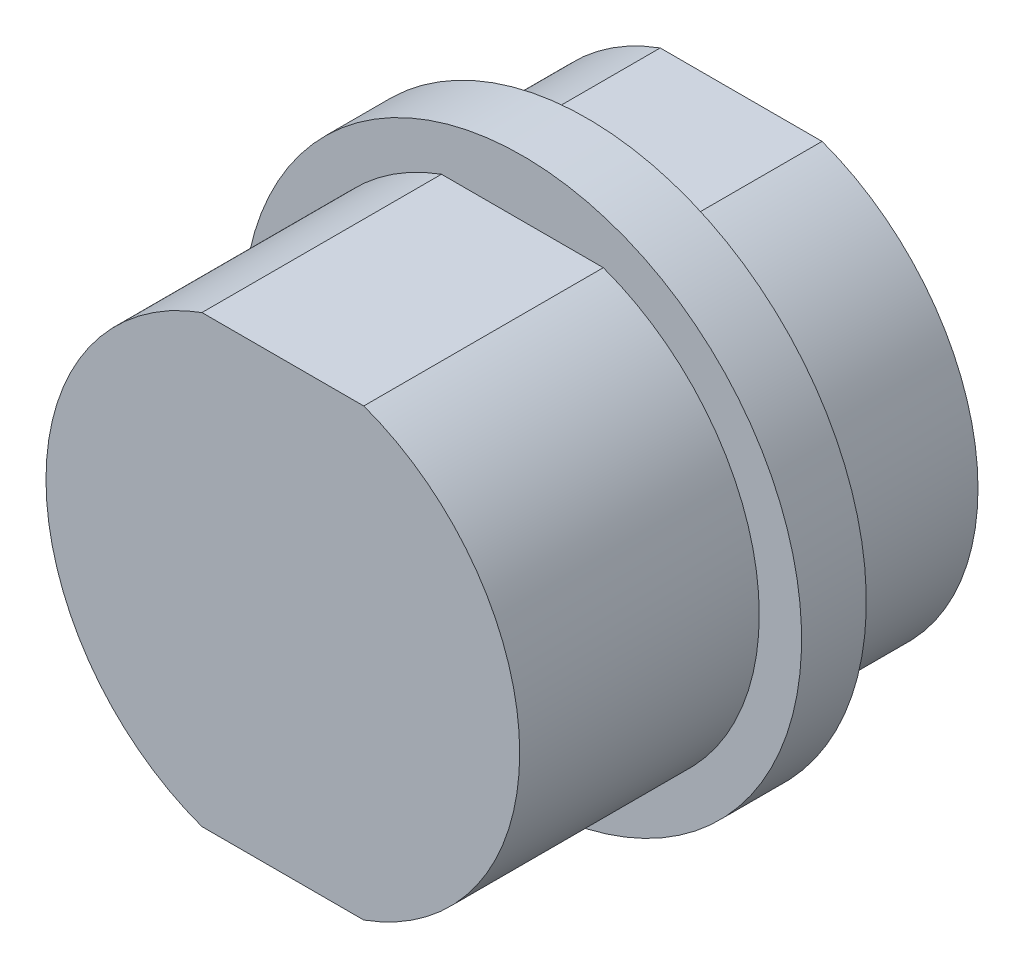
ISO-10303-21;
HEADER;
FILE_DESCRIPTION(('STEP AP214'),'2;1');
FILE_NAME('part.step','',(''),(''),'','','');
FILE_SCHEMA(('AUTOMOTIVE_DESIGN { 1 0 10303 214 1 1 1 1 }'));
ENDSEC;
DATA;
#1=APPLICATION_CONTEXT('core data for automotive mechanical design processes');
#2=APPLICATION_PROTOCOL_DEFINITION('international standard','automotive_design',2000,#1);
#3=PRODUCT_CONTEXT('',#1,'mechanical');
#4=PRODUCT('Part','Part','',(#3));
#5=PRODUCT_RELATED_PRODUCT_CATEGORY('part','',(#4));
#6=PRODUCT_DEFINITION_FORMATION('','',#4);
#7=PRODUCT_DEFINITION_CONTEXT('part definition',#1,'design');
#8=PRODUCT_DEFINITION('design','',#6,#7);
#9=PRODUCT_DEFINITION_SHAPE('','',#8);
#10=(LENGTH_UNIT() NAMED_UNIT(*) SI_UNIT(.MILLI.,.METRE.));
#11=(NAMED_UNIT(*) PLANE_ANGLE_UNIT() SI_UNIT($,.RADIAN.));
#12=(NAMED_UNIT(*) SI_UNIT($,.STERADIAN.) SOLID_ANGLE_UNIT());
#13=UNCERTAINTY_MEASURE_WITH_UNIT(LENGTH_MEASURE(1.E-05),#10,'distance_accuracy_value','');
#14=(GEOMETRIC_REPRESENTATION_CONTEXT(3) GLOBAL_UNCERTAINTY_ASSIGNED_CONTEXT((#13)) GLOBAL_UNIT_ASSIGNED_CONTEXT((#10,
#11,#12)) REPRESENTATION_CONTEXT('',''));
#15=CARTESIAN_POINT('',(0.,0.,0.));
#16=DIRECTION('',(0.,0.,1.));
#17=DIRECTION('',(1.,0.,0.));
#18=AXIS2_PLACEMENT_3D('',#15,#16,#17);
#19=CARTESIAN_POINT('',(0.,0.,15.113));
#20=DIRECTION('',(0.,0.,-1.));
#21=DIRECTION('',(-1.,0.,0.));
#22=AXIS2_PLACEMENT_3D('',#19,#20,#21);
#23=CYLINDRICAL_SURFACE('',#22,7.8105);
#24=CARTESIAN_POINT('',(0.,0.,7.2136));
#25=DIRECTION('',(0.,0.,-1.));
#26=DIRECTION('',(-1.,0.,0.));
#27=AXIS2_PLACEMENT_3D('',#24,#25,#26);
#28=CIRCLE('',#27,7.8105);
#29=CARTESIAN_POINT('',(2.66823947388536,7.3406,7.2136));
#30=VERTEX_POINT('',#29);
#31=CARTESIAN_POINT('',(2.66823947388536,-7.3406,7.2136));
#32=VERTEX_POINT('',#31);
#33=EDGE_CURVE('E56',#30,#32,#28,.T.);
#34=ORIENTED_EDGE('',*,*,#33,.F.);
#35=DIRECTION('',(0.,0.,-1.));
#36=VECTOR('',#35,1.);
#37=CARTESIAN_POINT('',(2.66823947388536,7.3406,15.113));
#38=LINE('',#37,#36);
#39=CARTESIAN_POINT('',(2.66823947388536,7.3406,15.113));
#40=VERTEX_POINT('',#39);
#41=EDGE_CURVE('E130',#30,#40,#38,.F.);
#42=ORIENTED_EDGE('',*,*,#41,.T.);
#43=CARTESIAN_POINT('',(0.,0.,15.113));
#44=DIRECTION('',(0.,0.,1.));
#45=DIRECTION('',(1.,0.,0.));
#46=AXIS2_PLACEMENT_3D('',#43,#44,#45);
#47=CIRCLE('',#46,7.8105);
#48=CARTESIAN_POINT('',(2.66823947388536,-7.3406,15.113));
#49=VERTEX_POINT('',#48);
#50=EDGE_CURVE('E140',#49,#40,#47,.T.);
#51=ORIENTED_EDGE('',*,*,#50,.F.);
#52=DIRECTION('',(0.,0.,-1.));
#53=VECTOR('',#52,1.);
#54=CARTESIAN_POINT('',(2.66823947388536,-7.3406,15.113));
#55=LINE('',#54,#53);
#56=EDGE_CURVE('E120',#49,#32,#55,.T.);
#57=ORIENTED_EDGE('',*,*,#56,.T.);
#58=EDGE_LOOP('',(#34,#42,#51,#57));
#59=FACE_BOUND('',#58,.T.);
#60=ADVANCED_FACE('F33',(#59),#23,.T.);
#61=CARTESIAN_POINT('',(0.,0.,7.2136));
#62=DIRECTION('',(0.,0.,-1.));
#63=DIRECTION('',(-1.,0.,0.));
#64=AXIS2_PLACEMENT_3D('',#61,#62,#63);
#65=CIRCLE('',#64,7.8105);
#66=CARTESIAN_POINT('',(-2.66823947388536,-7.3406,7.2136));
#67=VERTEX_POINT('',#66);
#68=CARTESIAN_POINT('',(-2.66823947388536,7.3406,7.2136));
#69=VERTEX_POINT('',#68);
#70=EDGE_CURVE('E154',#67,#69,#65,.T.);
#71=ORIENTED_EDGE('',*,*,#70,.F.);
#72=DIRECTION('',(0.,0.,-1.));
#73=VECTOR('',#72,1.);
#74=CARTESIAN_POINT('',(-2.66823947388536,-7.3406,15.113));
#75=LINE('',#74,#73);
#76=CARTESIAN_POINT('',(-2.66823947388536,-7.3406,15.113));
#77=VERTEX_POINT('',#76);
#78=EDGE_CURVE('E124',#67,#77,#75,.F.);
#79=ORIENTED_EDGE('',*,*,#78,.T.);
#80=CARTESIAN_POINT('',(-2.66823947388536,7.3406,15.113));
#81=VERTEX_POINT('',#80);
#82=EDGE_CURVE('E136',#81,#77,#47,.T.);
#83=ORIENTED_EDGE('',*,*,#82,.F.);
#84=DIRECTION('',(0.,0.,-1.));
#85=VECTOR('',#84,1.);
#86=CARTESIAN_POINT('',(-2.66823947388536,7.3406,15.113));
#87=LINE('',#86,#85);
#88=EDGE_CURVE('E133',#81,#69,#87,.T.);
#89=ORIENTED_EDGE('',*,*,#88,.T.);
#90=EDGE_LOOP('',(#71,#79,#83,#89));
#91=FACE_BOUND('',#90,.T.);
#92=ADVANCED_FACE('F168',(#91),#23,.T.);
#93=CARTESIAN_POINT('',(-7.44155178120373,7.3406,0.));
#94=DIRECTION('',(0.,-1.,0.));
#95=DIRECTION('',(0.,0.,-1.));
#96=AXIS2_PLACEMENT_3D('',#93,#94,#95);
#97=PLANE('',#96);
#98=DIRECTION('',(1.,0.,0.));
#99=VECTOR('',#98,1.);
#100=CARTESIAN_POINT('',(-7.44155178120373,7.3406,7.2136));
#101=LINE('',#100,#99);
#102=EDGE_CURVE('E48',#69,#30,#101,.T.);
#103=ORIENTED_EDGE('',*,*,#102,.F.);
#104=ORIENTED_EDGE('',*,*,#88,.F.);
#105=DIRECTION('',(1.,0.,0.));
#106=VECTOR('',#105,1.);
#107=CARTESIAN_POINT('',(-7.44155178120373,7.3406,15.113));
#108=LINE('',#107,#106);
#109=EDGE_CURVE('E123',#81,#40,#108,.T.);
#110=ORIENTED_EDGE('',*,*,#109,.T.);
#111=ORIENTED_EDGE('',*,*,#41,.F.);
#112=EDGE_LOOP('',(#103,#104,#110,#111));
#113=FACE_BOUND('',#112,.T.);
#114=ADVANCED_FACE('F192',(#113),#97,.F.);
#115=CARTESIAN_POINT('',(-7.44155178120373,-7.3406,0.));
#116=DIRECTION('',(0.,1.,0.));
#117=DIRECTION('',(0.,0.,1.));
#118=AXIS2_PLACEMENT_3D('',#115,#116,#117);
#119=PLANE('',#118);
#120=DIRECTION('',(-1.,0.,0.));
#121=VECTOR('',#120,1.);
#122=CARTESIAN_POINT('',(-7.44155178120373,-7.3406,7.2136));
#123=LINE('',#122,#121);
#124=EDGE_CURVE('E11',#32,#67,#123,.T.);
#125=ORIENTED_EDGE('',*,*,#124,.F.);
#126=ORIENTED_EDGE('',*,*,#56,.F.);
#127=DIRECTION('',(-1.,0.,0.));
#128=VECTOR('',#127,1.);
#129=CARTESIAN_POINT('',(-7.44155178120373,-7.3406,15.113));
#130=LINE('',#129,#128);
#131=EDGE_CURVE('E161',#49,#77,#130,.T.);
#132=ORIENTED_EDGE('',*,*,#131,.T.);
#133=ORIENTED_EDGE('',*,*,#78,.F.);
#134=EDGE_LOOP('',(#125,#126,#132,#133));
#135=FACE_BOUND('',#134,.T.);
#136=ADVANCED_FACE('F169',(#135),#119,.F.);
#137=CARTESIAN_POINT('',(0.,0.,15.113));
#138=DIRECTION('',(0.,0.,1.));
#139=DIRECTION('',(1.,0.,0.));
#140=AXIS2_PLACEMENT_3D('',#137,#138,#139);
#141=PLANE('',#140);
#142=ORIENTED_EDGE('',*,*,#131,.F.);
#143=ORIENTED_EDGE('',*,*,#50,.T.);
#144=ORIENTED_EDGE('',*,*,#109,.F.);
#145=ORIENTED_EDGE('',*,*,#82,.T.);
#146=EDGE_LOOP('',(#142,#143,#144,#145));
#147=FACE_BOUND('',#146,.T.);
#148=ADVANCED_FACE('F175',(#147),#141,.T.);
#149=CARTESIAN_POINT('',(0.,0.,7.2136));
#150=DIRECTION('',(0.,0.,-1.));
#151=DIRECTION('',(-1.,0.,0.));
#152=AXIS2_PLACEMENT_3D('',#149,#150,#151);
#153=PLANE('',#152);
#154=CARTESIAN_POINT('',(0.,0.,7.2136));
#155=DIRECTION('',(0.,0.,-1.));
#156=DIRECTION('',(-1.,0.,0.));
#157=AXIS2_PLACEMENT_3D('',#154,#155,#156);
#158=CIRCLE('',#157,9.2075);
#159=CARTESIAN_POINT('',(-9.2075,0.,7.2136));
#160=VERTEX_POINT('',#159);
#161=EDGE_CURVE('E219',#160,#160,#158,.T.);
#162=ORIENTED_EDGE('',*,*,#161,.F.);
#163=EDGE_LOOP('',(#162));
#164=FACE_BOUND('',#163,.T.);
#165=ORIENTED_EDGE('',*,*,#70,.T.);
#166=ORIENTED_EDGE('',*,*,#102,.T.);
#167=ORIENTED_EDGE('',*,*,#33,.T.);
#168=ORIENTED_EDGE('',*,*,#124,.T.);
#169=EDGE_LOOP('',(#165,#166,#167,#168));
#170=FACE_BOUND('',#169,.T.);
#171=ADVANCED_FACE('F173',(#164,#170),#153,.F.);
#172=CARTESIAN_POINT('',(0.,0.,5.08));
#173=DIRECTION('',(0.,0.,-1.));
#174=DIRECTION('',(-1.,0.,0.));
#175=AXIS2_PLACEMENT_3D('',#172,#173,#174);
#176=PLANE('',#175);
#177=CARTESIAN_POINT('',(0.,0.,5.08));
#178=DIRECTION('',(0.,0.,-1.));
#179=DIRECTION('',(-1.,0.,0.));
#180=AXIS2_PLACEMENT_3D('',#177,#178,#179);
#181=CIRCLE('',#180,9.2075);
#182=CARTESIAN_POINT('',(-9.2075,0.,5.08));
#183=VERTEX_POINT('',#182);
#184=EDGE_CURVE('E222',#183,#183,#181,.T.);
#185=ORIENTED_EDGE('',*,*,#184,.T.);
#186=EDGE_LOOP('',(#185));
#187=FACE_BOUND('',#186,.T.);
#188=DIRECTION('',(1.,0.,0.));
#189=VECTOR('',#188,1.);
#190=CARTESIAN_POINT('',(-7.44155178120373,7.3406,5.08));
#191=LINE('',#190,#189);
#192=CARTESIAN_POINT('',(-2.66823947388536,7.3406,5.08));
#193=VERTEX_POINT('',#192);
#194=CARTESIAN_POINT('',(2.66823947388536,7.3406,5.08));
#195=VERTEX_POINT('',#194);
#196=EDGE_CURVE('E115',#193,#195,#191,.T.);
#197=ORIENTED_EDGE('',*,*,#196,.F.);
#198=CARTESIAN_POINT('',(0.,0.,5.08));
#199=DIRECTION('',(0.,0.,-1.));
#200=DIRECTION('',(-1.,0.,0.));
#201=AXIS2_PLACEMENT_3D('',#198,#199,#200);
#202=CIRCLE('',#201,7.8105);
#203=CARTESIAN_POINT('',(-2.66823947388536,-7.3406,5.08));
#204=VERTEX_POINT('',#203);
#205=EDGE_CURVE('E103',#204,#193,#202,.T.);
#206=ORIENTED_EDGE('',*,*,#205,.F.);
#207=DIRECTION('',(-1.,0.,0.));
#208=VECTOR('',#207,1.);
#209=CARTESIAN_POINT('',(-7.44155178120373,-7.3406,5.08));
#210=LINE('',#209,#208);
#211=CARTESIAN_POINT('',(2.66823947388536,-7.3406,5.08));
#212=VERTEX_POINT('',#211);
#213=EDGE_CURVE('E41',#212,#204,#210,.T.);
#214=ORIENTED_EDGE('',*,*,#213,.F.);
#215=CARTESIAN_POINT('',(0.,0.,5.08));
#216=DIRECTION('',(0.,0.,-1.));
#217=DIRECTION('',(-1.,0.,0.));
#218=AXIS2_PLACEMENT_3D('',#215,#216,#217);
#219=CIRCLE('',#218,7.8105);
#220=EDGE_CURVE('E100',#195,#212,#219,.T.);
#221=ORIENTED_EDGE('',*,*,#220,.F.);
#222=EDGE_LOOP('',(#197,#206,#214,#221));
#223=FACE_BOUND('',#222,.T.);
#224=ADVANCED_FACE('F99',(#187,#223),#176,.T.);
#225=CARTESIAN_POINT('',(0.,0.,7.2136));
#226=DIRECTION('',(0.,0.,-1.));
#227=DIRECTION('',(-1.,0.,0.));
#228=AXIS2_PLACEMENT_3D('',#225,#226,#227);
#229=CYLINDRICAL_SURFACE('',#228,9.2075);
#230=ORIENTED_EDGE('',*,*,#161,.T.);
#231=EDGE_LOOP('',(#230));
#232=FACE_BOUND('',#231,.T.);
#233=ORIENTED_EDGE('',*,*,#184,.F.);
#234=EDGE_LOOP('',(#233));
#235=FACE_BOUND('',#234,.T.);
#236=ADVANCED_FACE('F182',(#232,#235),#229,.T.);
#237=CARTESIAN_POINT('',(0.,0.,0.));
#238=DIRECTION('',(0.,0.,1.));
#239=DIRECTION('',(1.,0.,0.));
#240=AXIS2_PLACEMENT_3D('',#237,#238,#239);
#241=PLANE('',#240);
#242=CARTESIAN_POINT('',(0.,0.,0.));
#243=DIRECTION('',(0.,0.,1.));
#244=DIRECTION('',(1.,0.,0.));
#245=AXIS2_PLACEMENT_3D('',#242,#243,#244);
#246=CIRCLE('',#245,7.8105);
#247=CARTESIAN_POINT('',(2.66823947388536,-7.3406,0.));
#248=VERTEX_POINT('',#247);
#249=CARTESIAN_POINT('',(2.66823947388536,7.3406,0.));
#250=VERTEX_POINT('',#249);
#251=EDGE_CURVE('E135',#248,#250,#246,.T.);
#252=ORIENTED_EDGE('',*,*,#251,.F.);
#253=DIRECTION('',(-1.,0.,0.));
#254=VECTOR('',#253,1.);
#255=CARTESIAN_POINT('',(0.,-7.3406,0.));
#256=LINE('',#255,#254);
#257=CARTESIAN_POINT('',(-2.66823947388536,-7.3406,0.));
#258=VERTEX_POINT('',#257);
#259=EDGE_CURVE('E107',#248,#258,#256,.T.);
#260=ORIENTED_EDGE('',*,*,#259,.T.);
#261=CARTESIAN_POINT('',(-2.66823947388536,7.3406,0.));
#262=VERTEX_POINT('',#261);
#263=EDGE_CURVE('E141',#262,#258,#246,.T.);
#264=ORIENTED_EDGE('',*,*,#263,.F.);
#265=DIRECTION('',(1.,0.,0.));
#266=VECTOR('',#265,1.);
#267=CARTESIAN_POINT('',(0.,7.3406,0.));
#268=LINE('',#267,#266);
#269=EDGE_CURVE('E139',#262,#250,#268,.T.);
#270=ORIENTED_EDGE('',*,*,#269,.T.);
#271=EDGE_LOOP('',(#252,#260,#264,#270));
#272=FACE_BOUND('',#271,.T.);
#273=ADVANCED_FACE('F148',(#272),#241,.F.);
#274=EDGE_CURVE('E132',#193,#262,#87,.T.);
#275=ORIENTED_EDGE('',*,*,#274,.F.);
#276=ORIENTED_EDGE('',*,*,#196,.T.);
#277=EDGE_CURVE('E114',#250,#195,#38,.F.);
#278=ORIENTED_EDGE('',*,*,#277,.F.);
#279=ORIENTED_EDGE('',*,*,#269,.F.);
#280=EDGE_LOOP('',(#275,#276,#278,#279));
#281=FACE_BOUND('',#280,.T.);
#282=ADVANCED_FACE('F153',(#281),#97,.F.);
#283=EDGE_CURVE('E111',#212,#248,#55,.T.);
#284=ORIENTED_EDGE('',*,*,#283,.F.);
#285=ORIENTED_EDGE('',*,*,#213,.T.);
#286=EDGE_CURVE('E121',#258,#204,#75,.F.);
#287=ORIENTED_EDGE('',*,*,#286,.F.);
#288=ORIENTED_EDGE('',*,*,#259,.F.);
#289=EDGE_LOOP('',(#284,#285,#287,#288));
#290=FACE_BOUND('',#289,.T.);
#291=ADVANCED_FACE('F117',(#290),#119,.F.);
#292=ORIENTED_EDGE('',*,*,#286,.T.);
#293=ORIENTED_EDGE('',*,*,#205,.T.);
#294=ORIENTED_EDGE('',*,*,#274,.T.);
#295=ORIENTED_EDGE('',*,*,#263,.T.);
#296=EDGE_LOOP('',(#292,#293,#294,#295));
#297=FACE_BOUND('',#296,.T.);
#298=ADVANCED_FACE('F35',(#297),#23,.T.);
#299=ORIENTED_EDGE('',*,*,#277,.T.);
#300=ORIENTED_EDGE('',*,*,#220,.T.);
#301=ORIENTED_EDGE('',*,*,#283,.T.);
#302=ORIENTED_EDGE('',*,*,#251,.T.);
#303=EDGE_LOOP('',(#299,#300,#301,#302));
#304=FACE_BOUND('',#303,.T.);
#305=ADVANCED_FACE('F110',(#304),#23,.T.);
#306=CLOSED_SHELL('',(#60,#92,#114,#136,#148,#171,#224,#236,#273,#282,#291,#298,#305));
#307=MANIFOLD_SOLID_BREP('B2',#306);
#308=ADVANCED_BREP_SHAPE_REPRESENTATION('',(#18,#307),#14);
#309=SHAPE_DEFINITION_REPRESENTATION(#9,#308);
ENDSEC;
END-ISO-10303-21;
